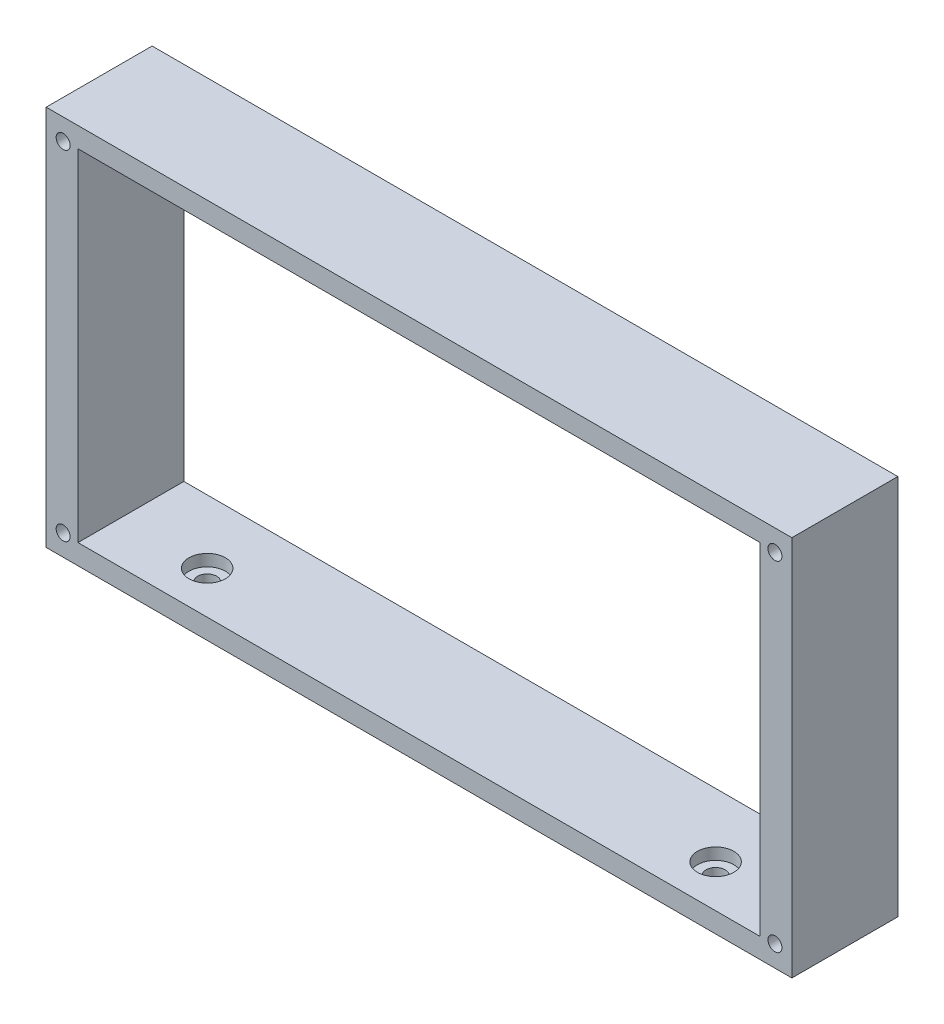
ISO-10303-21;
HEADER;
FILE_DESCRIPTION(('STEP AP214'),'2;1');
FILE_NAME('part.step','',(''),(''),'','','');
FILE_SCHEMA(('AUTOMOTIVE_DESIGN { 1 0 10303 214 1 1 1 1 }'));
ENDSEC;
DATA;
#1=APPLICATION_CONTEXT('core data for automotive mechanical design processes');
#2=APPLICATION_PROTOCOL_DEFINITION('international standard','automotive_design',2000,#1);
#3=PRODUCT_CONTEXT('',#1,'mechanical');
#4=PRODUCT('Part','Part','',(#3));
#5=PRODUCT_RELATED_PRODUCT_CATEGORY('part','',(#4));
#6=PRODUCT_DEFINITION_FORMATION('','',#4);
#7=PRODUCT_DEFINITION_CONTEXT('part definition',#1,'design');
#8=PRODUCT_DEFINITION('design','',#6,#7);
#9=PRODUCT_DEFINITION_SHAPE('','',#8);
#10=(LENGTH_UNIT() NAMED_UNIT(*) SI_UNIT(.MILLI.,.METRE.));
#11=(NAMED_UNIT(*) PLANE_ANGLE_UNIT() SI_UNIT($,.RADIAN.));
#12=(NAMED_UNIT(*) SI_UNIT($,.STERADIAN.) SOLID_ANGLE_UNIT());
#13=UNCERTAINTY_MEASURE_WITH_UNIT(LENGTH_MEASURE(1.E-05),#10,'distance_accuracy_value','');
#14=(GEOMETRIC_REPRESENTATION_CONTEXT(3) GLOBAL_UNCERTAINTY_ASSIGNED_CONTEXT((#13)) GLOBAL_UNIT_ASSIGNED_CONTEXT((#10,
#11,#12)) REPRESENTATION_CONTEXT('',''));
#15=CARTESIAN_POINT('',(0.,0.,0.));
#16=DIRECTION('',(0.,0.,1.));
#17=DIRECTION('',(1.,0.,0.));
#18=AXIS2_PLACEMENT_3D('',#15,#16,#17);
#19=CARTESIAN_POINT('',(0.,0.,25.));
#20=DIRECTION('',(0.,0.,-1.));
#21=DIRECTION('',(-1.,0.,0.));
#22=AXIS2_PLACEMENT_3D('',#19,#20,#21);
#23=PLANE('',#22);
#24=CARTESIAN_POINT('',(-84.,40.,25.));
#25=DIRECTION('',(0.,0.,-1.));
#26=DIRECTION('',(-1.,0.,0.));
#27=AXIS2_PLACEMENT_3D('',#24,#25,#26);
#28=CIRCLE('',#27,1.65);
#29=CARTESIAN_POINT('',(-85.65,40.,25.));
#30=VERTEX_POINT('',#29);
#31=EDGE_CURVE('E181',#30,#30,#28,.T.);
#32=ORIENTED_EDGE('',*,*,#31,.T.);
#33=EDGE_LOOP('',(#32));
#34=FACE_BOUND('',#33,.T.);
#35=CARTESIAN_POINT('',(84.,-40.,25.));
#36=DIRECTION('',(0.,0.,-1.));
#37=DIRECTION('',(-1.,0.,0.));
#38=AXIS2_PLACEMENT_3D('',#35,#36,#37);
#39=CIRCLE('',#38,1.65);
#40=CARTESIAN_POINT('',(82.35,-40.,25.));
#41=VERTEX_POINT('',#40);
#42=EDGE_CURVE('E187',#41,#41,#39,.T.);
#43=ORIENTED_EDGE('',*,*,#42,.T.);
#44=EDGE_LOOP('',(#43));
#45=FACE_BOUND('',#44,.T.);
#46=CARTESIAN_POINT('',(84.,40.,25.));
#47=DIRECTION('',(0.,0.,-1.));
#48=DIRECTION('',(-1.,0.,0.));
#49=AXIS2_PLACEMENT_3D('',#46,#47,#48);
#50=CIRCLE('',#49,1.65);
#51=CARTESIAN_POINT('',(82.35,40.,25.));
#52=VERTEX_POINT('',#51);
#53=EDGE_CURVE('E193',#52,#52,#50,.T.);
#54=ORIENTED_EDGE('',*,*,#53,.T.);
#55=EDGE_LOOP('',(#54));
#56=FACE_BOUND('',#55,.T.);
#57=CARTESIAN_POINT('',(-84.,-40.,25.));
#58=DIRECTION('',(0.,0.,-1.));
#59=DIRECTION('',(-1.,0.,0.));
#60=AXIS2_PLACEMENT_3D('',#57,#58,#59);
#61=CIRCLE('',#60,1.65);
#62=CARTESIAN_POINT('',(-85.65,-40.,25.));
#63=VERTEX_POINT('',#62);
#64=EDGE_CURVE('E199',#63,#63,#61,.T.);
#65=ORIENTED_EDGE('',*,*,#64,.T.);
#66=EDGE_LOOP('',(#65));
#67=FACE_BOUND('',#66,.T.);
#68=DIRECTION('',(0.,1.,0.));
#69=VECTOR('',#68,1.);
#70=CARTESIAN_POINT('',(88.,-45.,25.));
#71=LINE('',#70,#69);
#72=CARTESIAN_POINT('',(88.,-45.,25.));
#73=VERTEX_POINT('',#72);
#74=CARTESIAN_POINT('',(88.,45.,25.));
#75=VERTEX_POINT('',#74);
#76=EDGE_CURVE('E228',#73,#75,#71,.T.);
#77=ORIENTED_EDGE('',*,*,#76,.T.);
#78=DIRECTION('',(-1.,0.,0.));
#79=VECTOR('',#78,1.);
#80=CARTESIAN_POINT('',(-88.,45.,25.));
#81=LINE('',#80,#79);
#82=CARTESIAN_POINT('',(-88.,45.,25.));
#83=VERTEX_POINT('',#82);
#84=EDGE_CURVE('E231',#75,#83,#81,.T.);
#85=ORIENTED_EDGE('',*,*,#84,.T.);
#86=DIRECTION('',(0.,-1.,0.));
#87=VECTOR('',#86,1.);
#88=CARTESIAN_POINT('',(-88.,-45.,25.));
#89=LINE('',#88,#87);
#90=CARTESIAN_POINT('',(-88.,-45.,25.));
#91=VERTEX_POINT('',#90);
#92=EDGE_CURVE('E234',#83,#91,#89,.T.);
#93=ORIENTED_EDGE('',*,*,#92,.T.);
#94=DIRECTION('',(1.,0.,0.));
#95=VECTOR('',#94,1.);
#96=CARTESIAN_POINT('',(-88.,-45.,25.));
#97=LINE('',#96,#95);
#98=EDGE_CURVE('E236',#91,#73,#97,.T.);
#99=ORIENTED_EDGE('',*,*,#98,.T.);
#100=EDGE_LOOP('',(#77,#85,#93,#99));
#101=FACE_BOUND('',#100,.T.);
#102=DIRECTION('',(0.,1.,0.));
#103=VECTOR('',#102,1.);
#104=CARTESIAN_POINT('',(80.5,-40.25,25.));
#105=LINE('',#104,#103);
#106=CARTESIAN_POINT('',(80.5,-40.25,25.));
#107=VERTEX_POINT('',#106);
#108=CARTESIAN_POINT('',(80.5,40.25,25.));
#109=VERTEX_POINT('',#108);
#110=EDGE_CURVE('E202',#107,#109,#105,.T.);
#111=ORIENTED_EDGE('',*,*,#110,.F.);
#112=DIRECTION('',(1.,0.,0.));
#113=VECTOR('',#112,1.);
#114=CARTESIAN_POINT('',(-80.5,-40.25,25.));
#115=LINE('',#114,#113);
#116=CARTESIAN_POINT('',(-80.5,-40.25,25.));
#117=VERTEX_POINT('',#116);
#118=EDGE_CURVE('E209',#117,#107,#115,.T.);
#119=ORIENTED_EDGE('',*,*,#118,.F.);
#120=DIRECTION('',(0.,-1.,0.));
#121=VECTOR('',#120,1.);
#122=CARTESIAN_POINT('',(-80.5,-40.25,25.));
#123=LINE('',#122,#121);
#124=CARTESIAN_POINT('',(-80.5,40.25,25.));
#125=VERTEX_POINT('',#124);
#126=EDGE_CURVE('E207',#125,#117,#123,.T.);
#127=ORIENTED_EDGE('',*,*,#126,.F.);
#128=DIRECTION('',(-1.,0.,0.));
#129=VECTOR('',#128,1.);
#130=CARTESIAN_POINT('',(-80.5,40.25,25.));
#131=LINE('',#130,#129);
#132=EDGE_CURVE('E204',#109,#125,#131,.T.);
#133=ORIENTED_EDGE('',*,*,#132,.F.);
#134=EDGE_LOOP('',(#111,#119,#127,#133));
#135=FACE_BOUND('',#134,.T.);
#136=ADVANCED_FACE('F44',(#34,#45,#56,#67,#101,#135),#23,.F.);
#137=CARTESIAN_POINT('',(0.,0.,0.));
#138=DIRECTION('',(0.,0.,-1.));
#139=DIRECTION('',(-1.,0.,0.));
#140=AXIS2_PLACEMENT_3D('',#137,#138,#139);
#141=PLANE('',#140);
#142=CARTESIAN_POINT('',(-10.,42.5,0.));
#143=DIRECTION('',(0.,0.,-1.));
#144=DIRECTION('',(-1.,0.,0.));
#145=AXIS2_PLACEMENT_3D('',#142,#143,#144);
#146=CIRCLE('',#145,1.64999999999999);
#147=CARTESIAN_POINT('',(-11.65,42.5,0.));
#148=VERTEX_POINT('',#147);
#149=EDGE_CURVE('E132',#148,#148,#146,.T.);
#150=ORIENTED_EDGE('',*,*,#149,.F.);
#151=EDGE_LOOP('',(#150));
#152=FACE_BOUND('',#151,.T.);
#153=CARTESIAN_POINT('',(10.,-42.5,0.));
#154=DIRECTION('',(0.,0.,-1.));
#155=DIRECTION('',(-1.,0.,0.));
#156=AXIS2_PLACEMENT_3D('',#153,#154,#155);
#157=CIRCLE('',#156,1.64999999999999);
#158=CARTESIAN_POINT('',(8.35000000000001,-42.5,0.));
#159=VERTEX_POINT('',#158);
#160=EDGE_CURVE('E131',#159,#159,#157,.T.);
#161=ORIENTED_EDGE('',*,*,#160,.F.);
#162=EDGE_LOOP('',(#161));
#163=FACE_BOUND('',#162,.T.);
#164=CARTESIAN_POINT('',(10.,42.5,0.));
#165=DIRECTION('',(0.,0.,-1.));
#166=DIRECTION('',(-1.,0.,0.));
#167=AXIS2_PLACEMENT_3D('',#164,#165,#166);
#168=CIRCLE('',#167,1.64999999999999);
#169=CARTESIAN_POINT('',(8.35000000000001,42.5,0.));
#170=VERTEX_POINT('',#169);
#171=EDGE_CURVE('E142',#170,#170,#168,.T.);
#172=ORIENTED_EDGE('',*,*,#171,.F.);
#173=EDGE_LOOP('',(#172));
#174=FACE_BOUND('',#173,.T.);
#175=CARTESIAN_POINT('',(-10.,-42.5,0.));
#176=DIRECTION('',(0.,0.,-1.));
#177=DIRECTION('',(-1.,0.,0.));
#178=AXIS2_PLACEMENT_3D('',#175,#176,#177);
#179=CIRCLE('',#178,1.64999999999999);
#180=CARTESIAN_POINT('',(-11.65,-42.5,0.));
#181=VERTEX_POINT('',#180);
#182=EDGE_CURVE('E148',#181,#181,#179,.T.);
#183=ORIENTED_EDGE('',*,*,#182,.F.);
#184=EDGE_LOOP('',(#183));
#185=FACE_BOUND('',#184,.T.);
#186=CARTESIAN_POINT('',(-84.,40.,0.));
#187=DIRECTION('',(0.,0.,-1.));
#188=DIRECTION('',(-1.,0.,0.));
#189=AXIS2_PLACEMENT_3D('',#186,#187,#188);
#190=CIRCLE('',#189,1.64999999999998);
#191=CARTESIAN_POINT('',(-85.65,40.,0.));
#192=VERTEX_POINT('',#191);
#193=EDGE_CURVE('E178',#192,#192,#190,.T.);
#194=ORIENTED_EDGE('',*,*,#193,.F.);
#195=EDGE_LOOP('',(#194));
#196=FACE_BOUND('',#195,.T.);
#197=CARTESIAN_POINT('',(84.,-40.,0.));
#198=DIRECTION('',(0.,0.,-1.));
#199=DIRECTION('',(-1.,0.,0.));
#200=AXIS2_PLACEMENT_3D('',#197,#198,#199);
#201=CIRCLE('',#200,1.64999999999998);
#202=CARTESIAN_POINT('',(82.35,-40.,0.));
#203=VERTEX_POINT('',#202);
#204=EDGE_CURVE('E184',#203,#203,#201,.T.);
#205=ORIENTED_EDGE('',*,*,#204,.F.);
#206=EDGE_LOOP('',(#205));
#207=FACE_BOUND('',#206,.T.);
#208=CARTESIAN_POINT('',(84.,40.,0.));
#209=DIRECTION('',(0.,0.,-1.));
#210=DIRECTION('',(-1.,0.,0.));
#211=AXIS2_PLACEMENT_3D('',#208,#209,#210);
#212=CIRCLE('',#211,1.64999999999998);
#213=CARTESIAN_POINT('',(82.35,40.,0.));
#214=VERTEX_POINT('',#213);
#215=EDGE_CURVE('E190',#214,#214,#212,.T.);
#216=ORIENTED_EDGE('',*,*,#215,.F.);
#217=EDGE_LOOP('',(#216));
#218=FACE_BOUND('',#217,.T.);
#219=CARTESIAN_POINT('',(-84.,-40.,0.));
#220=DIRECTION('',(0.,0.,-1.));
#221=DIRECTION('',(-1.,0.,0.));
#222=AXIS2_PLACEMENT_3D('',#219,#220,#221);
#223=CIRCLE('',#222,1.64999999999998);
#224=CARTESIAN_POINT('',(-85.65,-40.,0.));
#225=VERTEX_POINT('',#224);
#226=EDGE_CURVE('E196',#225,#225,#223,.T.);
#227=ORIENTED_EDGE('',*,*,#226,.F.);
#228=EDGE_LOOP('',(#227));
#229=FACE_BOUND('',#228,.T.);
#230=DIRECTION('',(0.,1.,0.));
#231=VECTOR('',#230,1.);
#232=CARTESIAN_POINT('',(88.,-45.,0.));
#233=LINE('',#232,#231);
#234=CARTESIAN_POINT('',(88.,-45.,0.));
#235=VERTEX_POINT('',#234);
#236=CARTESIAN_POINT('',(88.,45.,0.));
#237=VERTEX_POINT('',#236);
#238=EDGE_CURVE('E227',#235,#237,#233,.T.);
#239=ORIENTED_EDGE('',*,*,#238,.F.);
#240=DIRECTION('',(1.,0.,0.));
#241=VECTOR('',#240,1.);
#242=CARTESIAN_POINT('',(-88.,-45.,0.));
#243=LINE('',#242,#241);
#244=CARTESIAN_POINT('',(-88.,-45.,0.));
#245=VERTEX_POINT('',#244);
#246=EDGE_CURVE('E232',#245,#235,#243,.T.);
#247=ORIENTED_EDGE('',*,*,#246,.F.);
#248=DIRECTION('',(0.,-1.,0.));
#249=VECTOR('',#248,1.);
#250=CARTESIAN_POINT('',(-88.,-45.,0.));
#251=LINE('',#250,#249);
#252=CARTESIAN_POINT('',(-88.,45.,0.));
#253=VERTEX_POINT('',#252);
#254=EDGE_CURVE('E243',#253,#245,#251,.T.);
#255=ORIENTED_EDGE('',*,*,#254,.F.);
#256=DIRECTION('',(-1.,0.,0.));
#257=VECTOR('',#256,1.);
#258=CARTESIAN_POINT('',(-88.,45.,0.));
#259=LINE('',#258,#257);
#260=EDGE_CURVE('E241',#237,#253,#259,.T.);
#261=ORIENTED_EDGE('',*,*,#260,.F.);
#262=EDGE_LOOP('',(#239,#247,#255,#261));
#263=FACE_BOUND('',#262,.T.);
#264=DIRECTION('',(1.,0.,0.));
#265=VECTOR('',#264,1.);
#266=CARTESIAN_POINT('',(-80.5,-40.25,0.));
#267=LINE('',#266,#265);
#268=CARTESIAN_POINT('',(-80.5,-40.25,0.));
#269=VERTEX_POINT('',#268);
#270=CARTESIAN_POINT('',(80.5,-40.25,0.));
#271=VERTEX_POINT('',#270);
#272=EDGE_CURVE('E205',#269,#271,#267,.T.);
#273=ORIENTED_EDGE('',*,*,#272,.T.);
#274=DIRECTION('',(0.,1.,0.));
#275=VECTOR('',#274,1.);
#276=CARTESIAN_POINT('',(80.5,-40.25,0.));
#277=LINE('',#276,#275);
#278=CARTESIAN_POINT('',(80.5,40.25,0.));
#279=VERTEX_POINT('',#278);
#280=EDGE_CURVE('E67',#271,#279,#277,.T.);
#281=ORIENTED_EDGE('',*,*,#280,.T.);
#282=DIRECTION('',(-1.,0.,0.));
#283=VECTOR('',#282,1.);
#284=CARTESIAN_POINT('',(-80.5,40.25,0.));
#285=LINE('',#284,#283);
#286=CARTESIAN_POINT('',(-80.5,40.25,0.));
#287=VERTEX_POINT('',#286);
#288=EDGE_CURVE('E213',#279,#287,#285,.T.);
#289=ORIENTED_EDGE('',*,*,#288,.T.);
#290=DIRECTION('',(0.,-1.,0.));
#291=VECTOR('',#290,1.);
#292=CARTESIAN_POINT('',(-80.5,-40.25,0.));
#293=LINE('',#292,#291);
#294=EDGE_CURVE('E216',#287,#269,#293,.T.);
#295=ORIENTED_EDGE('',*,*,#294,.T.);
#296=EDGE_LOOP('',(#273,#281,#289,#295));
#297=FACE_BOUND('',#296,.T.);
#298=ADVANCED_FACE('F261',(#152,#163,#174,#185,#196,#207,#218,#229,#263,#297),#141,.T.);
#299=CARTESIAN_POINT('',(88.,-45.,25.));
#300=DIRECTION('',(-1.,0.,0.));
#301=DIRECTION('',(0.,0.,1.));
#302=AXIS2_PLACEMENT_3D('',#299,#300,#301);
#303=PLANE('',#302);
#304=ORIENTED_EDGE('',*,*,#238,.T.);
#305=DIRECTION('',(0.,0.,-1.));
#306=VECTOR('',#305,1.);
#307=CARTESIAN_POINT('',(88.,45.,25.));
#308=LINE('',#307,#306);
#309=EDGE_CURVE('E11',#75,#237,#308,.T.);
#310=ORIENTED_EDGE('',*,*,#309,.F.);
#311=ORIENTED_EDGE('',*,*,#76,.F.);
#312=DIRECTION('',(0.,0.,-1.));
#313=VECTOR('',#312,1.);
#314=CARTESIAN_POINT('',(88.,-45.,25.));
#315=LINE('',#314,#313);
#316=EDGE_CURVE('E238',#73,#235,#315,.T.);
#317=ORIENTED_EDGE('',*,*,#316,.T.);
#318=EDGE_LOOP('',(#304,#310,#311,#317));
#319=FACE_BOUND('',#318,.T.);
#320=ADVANCED_FACE('F46',(#319),#303,.F.);
#321=CARTESIAN_POINT('',(-88.,45.,25.));
#322=DIRECTION('',(0.,-1.,0.));
#323=DIRECTION('',(0.,0.,-1.));
#324=AXIS2_PLACEMENT_3D('',#321,#322,#323);
#325=PLANE('',#324);
#326=ORIENTED_EDGE('',*,*,#260,.T.);
#327=DIRECTION('',(0.,0.,-1.));
#328=VECTOR('',#327,1.);
#329=CARTESIAN_POINT('',(-88.,45.,25.));
#330=LINE('',#329,#328);
#331=EDGE_CURVE('E52',#83,#253,#330,.T.);
#332=ORIENTED_EDGE('',*,*,#331,.F.);
#333=ORIENTED_EDGE('',*,*,#84,.F.);
#334=ORIENTED_EDGE('',*,*,#309,.T.);
#335=EDGE_LOOP('',(#326,#332,#333,#334));
#336=FACE_BOUND('',#335,.T.);
#337=ADVANCED_FACE('F272',(#336),#325,.F.);
#338=CARTESIAN_POINT('',(-88.,-45.,25.));
#339=DIRECTION('',(1.,0.,0.));
#340=DIRECTION('',(0.,0.,-1.));
#341=AXIS2_PLACEMENT_3D('',#338,#339,#340);
#342=PLANE('',#341);
#343=ORIENTED_EDGE('',*,*,#254,.T.);
#344=DIRECTION('',(0.,0.,-1.));
#345=VECTOR('',#344,1.);
#346=CARTESIAN_POINT('',(-88.,-45.,25.));
#347=LINE('',#346,#345);
#348=EDGE_CURVE('E248',#91,#245,#347,.T.);
#349=ORIENTED_EDGE('',*,*,#348,.F.);
#350=ORIENTED_EDGE('',*,*,#92,.F.);
#351=ORIENTED_EDGE('',*,*,#331,.T.);
#352=EDGE_LOOP('',(#343,#349,#350,#351));
#353=FACE_BOUND('',#352,.T.);
#354=ADVANCED_FACE('F255',(#353),#342,.F.);
#355=CARTESIAN_POINT('',(-88.,-45.,25.));
#356=DIRECTION('',(0.,1.,0.));
#357=DIRECTION('',(0.,0.,1.));
#358=AXIS2_PLACEMENT_3D('',#355,#356,#357);
#359=PLANE('',#358);
#360=CARTESIAN_POINT('',(-60.,-45.,15.));
#361=DIRECTION('',(0.,1.,0.));
#362=DIRECTION('',(0.,0.,1.));
#363=AXIS2_PLACEMENT_3D('',#360,#361,#362);
#364=CIRCLE('',#363,2.25);
#365=CARTESIAN_POINT('',(-60.,-45.,17.25));
#366=VERTEX_POINT('',#365);
#367=EDGE_CURVE('E163',#366,#366,#364,.T.);
#368=ORIENTED_EDGE('',*,*,#367,.T.);
#369=EDGE_LOOP('',(#368));
#370=FACE_BOUND('',#369,.T.);
#371=CARTESIAN_POINT('',(60.,-45.,15.));
#372=DIRECTION('',(0.,1.,0.));
#373=DIRECTION('',(0.,0.,1.));
#374=AXIS2_PLACEMENT_3D('',#371,#372,#373);
#375=CIRCLE('',#374,2.25);
#376=CARTESIAN_POINT('',(60.,-45.,17.25));
#377=VERTEX_POINT('',#376);
#378=EDGE_CURVE('E175',#377,#377,#375,.T.);
#379=ORIENTED_EDGE('',*,*,#378,.T.);
#380=EDGE_LOOP('',(#379));
#381=FACE_BOUND('',#380,.T.);
#382=ORIENTED_EDGE('',*,*,#246,.T.);
#383=ORIENTED_EDGE('',*,*,#316,.F.);
#384=ORIENTED_EDGE('',*,*,#98,.F.);
#385=ORIENTED_EDGE('',*,*,#348,.T.);
#386=EDGE_LOOP('',(#382,#383,#384,#385));
#387=FACE_BOUND('',#386,.T.);
#388=ADVANCED_FACE('F265',(#370,#381,#387),#359,.F.);
#389=CARTESIAN_POINT('',(80.5,-40.25,25.));
#390=DIRECTION('',(-1.,0.,0.));
#391=DIRECTION('',(0.,0.,1.));
#392=AXIS2_PLACEMENT_3D('',#389,#390,#391);
#393=PLANE('',#392);
#394=ORIENTED_EDGE('',*,*,#280,.F.);
#395=DIRECTION('',(0.,0.,-1.));
#396=VECTOR('',#395,1.);
#397=CARTESIAN_POINT('',(80.5,-40.25,25.));
#398=LINE('',#397,#396);
#399=EDGE_CURVE('E211',#107,#271,#398,.T.);
#400=ORIENTED_EDGE('',*,*,#399,.F.);
#401=ORIENTED_EDGE('',*,*,#110,.T.);
#402=DIRECTION('',(0.,0.,-1.));
#403=VECTOR('',#402,1.);
#404=CARTESIAN_POINT('',(80.5,40.25,25.));
#405=LINE('',#404,#403);
#406=EDGE_CURVE('E225',#109,#279,#405,.T.);
#407=ORIENTED_EDGE('',*,*,#406,.T.);
#408=EDGE_LOOP('',(#394,#400,#401,#407));
#409=FACE_BOUND('',#408,.T.);
#410=ADVANCED_FACE('F290',(#409),#393,.T.);
#411=CARTESIAN_POINT('',(-80.5,40.25,25.));
#412=DIRECTION('',(0.,-1.,0.));
#413=DIRECTION('',(0.,0.,-1.));
#414=AXIS2_PLACEMENT_3D('',#411,#412,#413);
#415=PLANE('',#414);
#416=ORIENTED_EDGE('',*,*,#288,.F.);
#417=ORIENTED_EDGE('',*,*,#406,.F.);
#418=ORIENTED_EDGE('',*,*,#132,.T.);
#419=DIRECTION('',(0.,0.,-1.));
#420=VECTOR('',#419,1.);
#421=CARTESIAN_POINT('',(-80.5,40.25,25.));
#422=LINE('',#421,#420);
#423=EDGE_CURVE('E223',#125,#287,#422,.T.);
#424=ORIENTED_EDGE('',*,*,#423,.T.);
#425=EDGE_LOOP('',(#416,#417,#418,#424));
#426=FACE_BOUND('',#425,.T.);
#427=ADVANCED_FACE('F298',(#426),#415,.T.);
#428=CARTESIAN_POINT('',(-80.5,-40.25,25.));
#429=DIRECTION('',(1.,0.,0.));
#430=DIRECTION('',(0.,0.,-1.));
#431=AXIS2_PLACEMENT_3D('',#428,#429,#430);
#432=PLANE('',#431);
#433=ORIENTED_EDGE('',*,*,#294,.F.);
#434=ORIENTED_EDGE('',*,*,#423,.F.);
#435=ORIENTED_EDGE('',*,*,#126,.T.);
#436=DIRECTION('',(0.,0.,-1.));
#437=VECTOR('',#436,1.);
#438=CARTESIAN_POINT('',(-80.5,-40.25,25.));
#439=LINE('',#438,#437);
#440=EDGE_CURVE('E59',#117,#269,#439,.T.);
#441=ORIENTED_EDGE('',*,*,#440,.T.);
#442=EDGE_LOOP('',(#433,#434,#435,#441));
#443=FACE_BOUND('',#442,.T.);
#444=ADVANCED_FACE('F326',(#443),#432,.T.);
#445=CARTESIAN_POINT('',(-80.5,-40.25,25.));
#446=DIRECTION('',(0.,1.,0.));
#447=DIRECTION('',(0.,0.,1.));
#448=AXIS2_PLACEMENT_3D('',#445,#446,#447);
#449=PLANE('',#448);
#450=CARTESIAN_POINT('',(-60.,-40.25,15.));
#451=DIRECTION('',(0.,1.,0.));
#452=DIRECTION('',(0.,0.,1.));
#453=AXIS2_PLACEMENT_3D('',#450,#451,#452);
#454=CIRCLE('',#453,4.3);
#455=CARTESIAN_POINT('',(-60.,-40.25,19.3));
#456=VERTEX_POINT('',#455);
#457=EDGE_CURVE('E154',#456,#456,#454,.T.);
#458=ORIENTED_EDGE('',*,*,#457,.F.);
#459=EDGE_LOOP('',(#458));
#460=FACE_BOUND('',#459,.T.);
#461=CARTESIAN_POINT('',(60.,-40.25,15.));
#462=DIRECTION('',(0.,1.,0.));
#463=DIRECTION('',(0.,0.,1.));
#464=AXIS2_PLACEMENT_3D('',#461,#462,#463);
#465=CIRCLE('',#464,4.3);
#466=CARTESIAN_POINT('',(60.,-40.25,19.3));
#467=VERTEX_POINT('',#466);
#468=EDGE_CURVE('E166',#467,#467,#465,.T.);
#469=ORIENTED_EDGE('',*,*,#468,.F.);
#470=EDGE_LOOP('',(#469));
#471=FACE_BOUND('',#470,.T.);
#472=ORIENTED_EDGE('',*,*,#272,.F.);
#473=ORIENTED_EDGE('',*,*,#440,.F.);
#474=ORIENTED_EDGE('',*,*,#118,.T.);
#475=ORIENTED_EDGE('',*,*,#399,.T.);
#476=EDGE_LOOP('',(#472,#473,#474,#475));
#477=FACE_BOUND('',#476,.T.);
#478=ADVANCED_FACE('F323',(#460,#471,#477),#449,.T.);
#479=CARTESIAN_POINT('',(-84.,-40.,0.));
#480=DIRECTION('',(0.,0.,-1.));
#481=DIRECTION('',(-1.,0.,0.));
#482=AXIS2_PLACEMENT_3D('',#479,#480,#481);
#483=CYLINDRICAL_SURFACE('',#482,1.64999999999999);
#484=ORIENTED_EDGE('',*,*,#64,.F.);
#485=EDGE_LOOP('',(#484));
#486=FACE_BOUND('',#485,.T.);
#487=ORIENTED_EDGE('',*,*,#226,.T.);
#488=EDGE_LOOP('',(#487));
#489=FACE_BOUND('',#488,.T.);
#490=ADVANCED_FACE('F325',(#486,#489),#483,.F.);
#491=CARTESIAN_POINT('',(84.,40.,0.));
#492=DIRECTION('',(0.,0.,-1.));
#493=DIRECTION('',(-1.,0.,0.));
#494=AXIS2_PLACEMENT_3D('',#491,#492,#493);
#495=CYLINDRICAL_SURFACE('',#494,1.64999999999999);
#496=ORIENTED_EDGE('',*,*,#53,.F.);
#497=EDGE_LOOP('',(#496));
#498=FACE_BOUND('',#497,.T.);
#499=ORIENTED_EDGE('',*,*,#215,.T.);
#500=EDGE_LOOP('',(#499));
#501=FACE_BOUND('',#500,.T.);
#502=ADVANCED_FACE('F346',(#498,#501),#495,.F.);
#503=CARTESIAN_POINT('',(84.,-40.,0.));
#504=DIRECTION('',(0.,0.,-1.));
#505=DIRECTION('',(-1.,0.,0.));
#506=AXIS2_PLACEMENT_3D('',#503,#504,#505);
#507=CYLINDRICAL_SURFACE('',#506,1.64999999999999);
#508=ORIENTED_EDGE('',*,*,#42,.F.);
#509=EDGE_LOOP('',(#508));
#510=FACE_BOUND('',#509,.T.);
#511=ORIENTED_EDGE('',*,*,#204,.T.);
#512=EDGE_LOOP('',(#511));
#513=FACE_BOUND('',#512,.T.);
#514=ADVANCED_FACE('F350',(#510,#513),#507,.F.);
#515=CARTESIAN_POINT('',(-84.,40.,0.));
#516=DIRECTION('',(0.,0.,-1.));
#517=DIRECTION('',(-1.,0.,0.));
#518=AXIS2_PLACEMENT_3D('',#515,#516,#517);
#519=CYLINDRICAL_SURFACE('',#518,1.64999999999999);
#520=ORIENTED_EDGE('',*,*,#31,.F.);
#521=EDGE_LOOP('',(#520));
#522=FACE_BOUND('',#521,.T.);
#523=ORIENTED_EDGE('',*,*,#193,.T.);
#524=EDGE_LOOP('',(#523));
#525=FACE_BOUND('',#524,.T.);
#526=ADVANCED_FACE('F307',(#522,#525),#519,.F.);
#527=CARTESIAN_POINT('',(60.,-40.25,15.));
#528=DIRECTION('',(0.,1.,0.));
#529=DIRECTION('',(0.,0.,1.));
#530=AXIS2_PLACEMENT_3D('',#527,#528,#529);
#531=CYLINDRICAL_SURFACE('',#530,2.25);
#532=ORIENTED_EDGE('',*,*,#378,.F.);
#533=EDGE_LOOP('',(#532));
#534=FACE_BOUND('',#533,.T.);
#535=CARTESIAN_POINT('',(60.,-43.,15.));
#536=DIRECTION('',(0.,1.,0.));
#537=DIRECTION('',(0.,0.,1.));
#538=AXIS2_PLACEMENT_3D('',#535,#536,#537);
#539=CIRCLE('',#538,2.25);
#540=CARTESIAN_POINT('',(60.,-43.,17.25));
#541=VERTEX_POINT('',#540);
#542=EDGE_CURVE('E172',#541,#541,#539,.T.);
#543=ORIENTED_EDGE('',*,*,#542,.T.);
#544=EDGE_LOOP('',(#543));
#545=FACE_BOUND('',#544,.T.);
#546=ADVANCED_FACE('F303',(#534,#545),#531,.F.);
#547=CARTESIAN_POINT('',(62.25,-43.,15.));
#548=DIRECTION('',(0.,-1.,0.));
#549=DIRECTION('',(0.,0.,-1.));
#550=AXIS2_PLACEMENT_3D('',#547,#548,#549);
#551=PLANE('',#550);
#552=ORIENTED_EDGE('',*,*,#542,.F.);
#553=EDGE_LOOP('',(#552));
#554=FACE_BOUND('',#553,.T.);
#555=CARTESIAN_POINT('',(60.,-43.,15.));
#556=DIRECTION('',(0.,1.,0.));
#557=DIRECTION('',(0.,0.,1.));
#558=AXIS2_PLACEMENT_3D('',#555,#556,#557);
#559=CIRCLE('',#558,4.3);
#560=CARTESIAN_POINT('',(60.,-43.,19.3));
#561=VERTEX_POINT('',#560);
#562=EDGE_CURVE('E169',#561,#561,#559,.T.);
#563=ORIENTED_EDGE('',*,*,#562,.T.);
#564=EDGE_LOOP('',(#563));
#565=FACE_BOUND('',#564,.T.);
#566=ADVANCED_FACE('F306',(#554,#565),#551,.F.);
#567=CARTESIAN_POINT('',(60.,-40.25,15.));
#568=DIRECTION('',(0.,1.,0.));
#569=DIRECTION('',(0.,0.,1.));
#570=AXIS2_PLACEMENT_3D('',#567,#568,#569);
#571=CYLINDRICAL_SURFACE('',#570,4.3);
#572=ORIENTED_EDGE('',*,*,#562,.F.);
#573=EDGE_LOOP('',(#572));
#574=FACE_BOUND('',#573,.T.);
#575=ORIENTED_EDGE('',*,*,#468,.T.);
#576=EDGE_LOOP('',(#575));
#577=FACE_BOUND('',#576,.T.);
#578=ADVANCED_FACE('F313',(#574,#577),#571,.F.);
#579=CARTESIAN_POINT('',(-60.,-40.25,15.));
#580=DIRECTION('',(0.,1.,0.));
#581=DIRECTION('',(0.,0.,1.));
#582=AXIS2_PLACEMENT_3D('',#579,#580,#581);
#583=CYLINDRICAL_SURFACE('',#582,2.25);
#584=ORIENTED_EDGE('',*,*,#367,.F.);
#585=EDGE_LOOP('',(#584));
#586=FACE_BOUND('',#585,.T.);
#587=CARTESIAN_POINT('',(-60.,-43.,15.));
#588=DIRECTION('',(0.,1.,0.));
#589=DIRECTION('',(0.,0.,1.));
#590=AXIS2_PLACEMENT_3D('',#587,#588,#589);
#591=CIRCLE('',#590,2.25);
#592=CARTESIAN_POINT('',(-60.,-43.,17.25));
#593=VERTEX_POINT('',#592);
#594=EDGE_CURVE('E160',#593,#593,#591,.T.);
#595=ORIENTED_EDGE('',*,*,#594,.T.);
#596=EDGE_LOOP('',(#595));
#597=FACE_BOUND('',#596,.T.);
#598=ADVANCED_FACE('F319',(#586,#597),#583,.F.);
#599=CARTESIAN_POINT('',(-57.75,-43.,15.));
#600=DIRECTION('',(0.,-1.,0.));
#601=DIRECTION('',(0.,0.,-1.));
#602=AXIS2_PLACEMENT_3D('',#599,#600,#601);
#603=PLANE('',#602);
#604=ORIENTED_EDGE('',*,*,#594,.F.);
#605=EDGE_LOOP('',(#604));
#606=FACE_BOUND('',#605,.T.);
#607=CARTESIAN_POINT('',(-60.,-43.,15.));
#608=DIRECTION('',(0.,1.,0.));
#609=DIRECTION('',(0.,0.,1.));
#610=AXIS2_PLACEMENT_3D('',#607,#608,#609);
#611=CIRCLE('',#610,4.3);
#612=CARTESIAN_POINT('',(-60.,-43.,19.3));
#613=VERTEX_POINT('',#612);
#614=EDGE_CURVE('E157',#613,#613,#611,.T.);
#615=ORIENTED_EDGE('',*,*,#614,.T.);
#616=EDGE_LOOP('',(#615));
#617=FACE_BOUND('',#616,.T.);
#618=ADVANCED_FACE('F360',(#606,#617),#603,.F.);
#619=CARTESIAN_POINT('',(-60.,-40.25,15.));
#620=DIRECTION('',(0.,1.,0.));
#621=DIRECTION('',(0.,0.,1.));
#622=AXIS2_PLACEMENT_3D('',#619,#620,#621);
#623=CYLINDRICAL_SURFACE('',#622,4.3);
#624=ORIENTED_EDGE('',*,*,#614,.F.);
#625=EDGE_LOOP('',(#624));
#626=FACE_BOUND('',#625,.T.);
#627=ORIENTED_EDGE('',*,*,#457,.T.);
#628=EDGE_LOOP('',(#627));
#629=FACE_BOUND('',#628,.T.);
#630=ADVANCED_FACE('F364',(#626,#629),#623,.F.);
#631=CARTESIAN_POINT('',(-10.,-42.5,5.));
#632=DIRECTION('',(0.,0.,-1.));
#633=DIRECTION('',(-1.,0.,0.));
#634=AXIS2_PLACEMENT_3D('',#631,#632,#633);
#635=CONICAL_SURFACE('',#634,1.65,1.02974425867665);
#636=CARTESIAN_POINT('',(-10.,-42.5,5.99142002139548));
#637=VERTEX_POINT('',#636);
#638=VERTEX_LOOP('',#637);
#639=FACE_BOUND('',#638,.T.);
#640=CARTESIAN_POINT('',(-10.,-42.5,5.));
#641=DIRECTION('',(0.,0.,-1.));
#642=DIRECTION('',(-1.,0.,0.));
#643=AXIS2_PLACEMENT_3D('',#640,#641,#642);
#644=CIRCLE('',#643,1.65);
#645=CARTESIAN_POINT('',(-11.65,-42.5,5.));
#646=VERTEX_POINT('',#645);
#647=EDGE_CURVE('E151',#646,#646,#644,.T.);
#648=ORIENTED_EDGE('',*,*,#647,.T.);
#649=EDGE_LOOP('',(#648));
#650=FACE_BOUND('',#649,.T.);
#651=ADVANCED_FACE('F368',(#639,#650),#635,.F.);
#652=CARTESIAN_POINT('',(-10.,-42.5,0.));
#653=DIRECTION('',(0.,0.,-1.));
#654=DIRECTION('',(-1.,0.,0.));
#655=AXIS2_PLACEMENT_3D('',#652,#653,#654);
#656=CYLINDRICAL_SURFACE('',#655,1.64999999999999);
#657=ORIENTED_EDGE('',*,*,#647,.F.);
#658=EDGE_LOOP('',(#657));
#659=FACE_BOUND('',#658,.T.);
#660=ORIENTED_EDGE('',*,*,#182,.T.);
#661=EDGE_LOOP('',(#660));
#662=FACE_BOUND('',#661,.T.);
#663=ADVANCED_FACE('F372',(#659,#662),#656,.F.);
#664=CARTESIAN_POINT('',(10.,42.5,5.));
#665=DIRECTION('',(0.,0.,-1.));
#666=DIRECTION('',(-1.,0.,0.));
#667=AXIS2_PLACEMENT_3D('',#664,#665,#666);
#668=CONICAL_SURFACE('',#667,1.65,1.02974425867665);
#669=CARTESIAN_POINT('',(10.,42.5,5.99142002139548));
#670=VERTEX_POINT('',#669);
#671=VERTEX_LOOP('',#670);
#672=FACE_BOUND('',#671,.T.);
#673=CARTESIAN_POINT('',(10.,42.5,5.));
#674=DIRECTION('',(0.,0.,-1.));
#675=DIRECTION('',(-1.,0.,0.));
#676=AXIS2_PLACEMENT_3D('',#673,#674,#675);
#677=CIRCLE('',#676,1.65);
#678=CARTESIAN_POINT('',(8.35000000000001,42.5,5.));
#679=VERTEX_POINT('',#678);
#680=EDGE_CURVE('E145',#679,#679,#677,.T.);
#681=ORIENTED_EDGE('',*,*,#680,.T.);
#682=EDGE_LOOP('',(#681));
#683=FACE_BOUND('',#682,.T.);
#684=ADVANCED_FACE('F376',(#672,#683),#668,.F.);
#685=CARTESIAN_POINT('',(10.,42.5,0.));
#686=DIRECTION('',(0.,0.,-1.));
#687=DIRECTION('',(-1.,0.,0.));
#688=AXIS2_PLACEMENT_3D('',#685,#686,#687);
#689=CYLINDRICAL_SURFACE('',#688,1.64999999999999);
#690=ORIENTED_EDGE('',*,*,#680,.F.);
#691=EDGE_LOOP('',(#690));
#692=FACE_BOUND('',#691,.T.);
#693=ORIENTED_EDGE('',*,*,#171,.T.);
#694=EDGE_LOOP('',(#693));
#695=FACE_BOUND('',#694,.T.);
#696=ADVANCED_FACE('F380',(#692,#695),#689,.F.);
#697=CARTESIAN_POINT('',(10.,-42.5,5.));
#698=DIRECTION('',(0.,0.,-1.));
#699=DIRECTION('',(-1.,0.,0.));
#700=AXIS2_PLACEMENT_3D('',#697,#698,#699);
#701=CONICAL_SURFACE('',#700,1.65,1.02974425867665);
#702=CARTESIAN_POINT('',(10.,-42.5,5.99142002139548));
#703=VERTEX_POINT('',#702);
#704=VERTEX_LOOP('',#703);
#705=FACE_BOUND('',#704,.T.);
#706=CARTESIAN_POINT('',(10.,-42.5,5.));
#707=DIRECTION('',(0.,0.,-1.));
#708=DIRECTION('',(-1.,0.,0.));
#709=AXIS2_PLACEMENT_3D('',#706,#707,#708);
#710=CIRCLE('',#709,1.65);
#711=CARTESIAN_POINT('',(8.35000000000001,-42.5,5.));
#712=VERTEX_POINT('',#711);
#713=EDGE_CURVE('E135',#712,#712,#710,.T.);
#714=ORIENTED_EDGE('',*,*,#713,.T.);
#715=EDGE_LOOP('',(#714));
#716=FACE_BOUND('',#715,.T.);
#717=ADVANCED_FACE('F384',(#705,#716),#701,.F.);
#718=CARTESIAN_POINT('',(10.,-42.5,0.));
#719=DIRECTION('',(0.,0.,-1.));
#720=DIRECTION('',(-1.,0.,0.));
#721=AXIS2_PLACEMENT_3D('',#718,#719,#720);
#722=CYLINDRICAL_SURFACE('',#721,1.64999999999999);
#723=ORIENTED_EDGE('',*,*,#713,.F.);
#724=EDGE_LOOP('',(#723));
#725=FACE_BOUND('',#724,.T.);
#726=ORIENTED_EDGE('',*,*,#160,.T.);
#727=EDGE_LOOP('',(#726));
#728=FACE_BOUND('',#727,.T.);
#729=ADVANCED_FACE('F125',(#725,#728),#722,.F.);
#730=CARTESIAN_POINT('',(-10.,42.5,5.));
#731=DIRECTION('',(0.,0.,-1.));
#732=DIRECTION('',(-1.,0.,0.));
#733=AXIS2_PLACEMENT_3D('',#730,#731,#732);
#734=CONICAL_SURFACE('',#733,1.65,1.02974425867665);
#735=CARTESIAN_POINT('',(-10.,42.5,5.99142002139548));
#736=VERTEX_POINT('',#735);
#737=VERTEX_LOOP('',#736);
#738=FACE_BOUND('',#737,.T.);
#739=CARTESIAN_POINT('',(-10.,42.5,5.));
#740=DIRECTION('',(0.,0.,-1.));
#741=DIRECTION('',(-1.,0.,0.));
#742=AXIS2_PLACEMENT_3D('',#739,#740,#741);
#743=CIRCLE('',#742,1.65);
#744=CARTESIAN_POINT('',(-11.65,42.5,5.));
#745=VERTEX_POINT('',#744);
#746=EDGE_CURVE('E129',#745,#745,#743,.T.);
#747=ORIENTED_EDGE('',*,*,#746,.T.);
#748=EDGE_LOOP('',(#747));
#749=FACE_BOUND('',#748,.T.);
#750=ADVANCED_FACE('F121',(#738,#749),#734,.F.);
#751=CARTESIAN_POINT('',(-10.,42.5,0.));
#752=DIRECTION('',(0.,0.,-1.));
#753=DIRECTION('',(-1.,0.,0.));
#754=AXIS2_PLACEMENT_3D('',#751,#752,#753);
#755=CYLINDRICAL_SURFACE('',#754,1.64999999999999);
#756=ORIENTED_EDGE('',*,*,#746,.F.);
#757=EDGE_LOOP('',(#756));
#758=FACE_BOUND('',#757,.T.);
#759=ORIENTED_EDGE('',*,*,#149,.T.);
#760=EDGE_LOOP('',(#759));
#761=FACE_BOUND('',#760,.T.);
#762=ADVANCED_FACE('F124',(#758,#761),#755,.F.);
#763=CLOSED_SHELL('',(#136,#298,#320,#337,#354,#388,#410,#427,#444,#478,#490,#502,#514,#526,
#546,#566,#578,#598,#618,#630,#651,#663,#684,#696,#717,#729,#750,#762));
#764=MANIFOLD_SOLID_BREP('B2',#763);
#765=ADVANCED_BREP_SHAPE_REPRESENTATION('',(#18,#764),#14);
#766=SHAPE_DEFINITION_REPRESENTATION(#9,#765);
ENDSEC;
END-ISO-10303-21;
